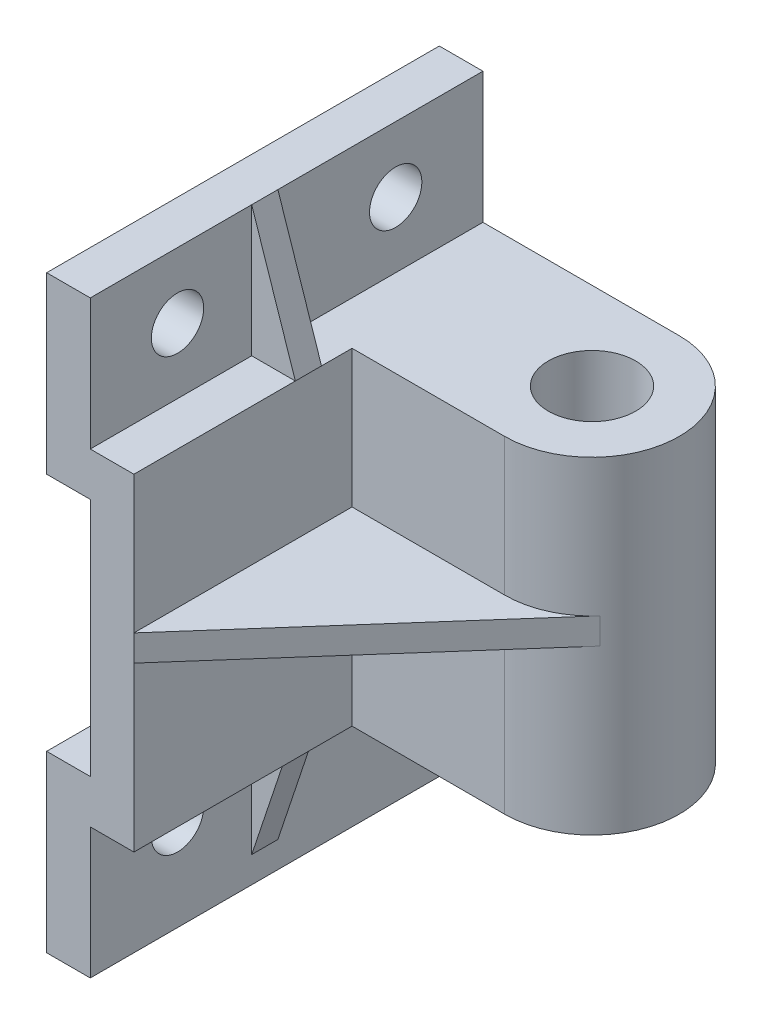
ISO-10303-21;
HEADER;
FILE_DESCRIPTION(('STEP AP214'),'2;1');
FILE_NAME('part.step','',(''),(''),'','','');
FILE_SCHEMA(('AUTOMOTIVE_DESIGN { 1 0 10303 214 1 1 1 1 }'));
ENDSEC;
DATA;
#1=APPLICATION_CONTEXT('core data for automotive mechanical design processes');
#2=APPLICATION_PROTOCOL_DEFINITION('international standard','automotive_design',2000,#1);
#3=PRODUCT_CONTEXT('',#1,'mechanical');
#4=PRODUCT('Part','Part','',(#3));
#5=PRODUCT_RELATED_PRODUCT_CATEGORY('part','',(#4));
#6=PRODUCT_DEFINITION_FORMATION('','',#4);
#7=PRODUCT_DEFINITION_CONTEXT('part definition',#1,'design');
#8=PRODUCT_DEFINITION('design','',#6,#7);
#9=PRODUCT_DEFINITION_SHAPE('','',#8);
#10=(LENGTH_UNIT() NAMED_UNIT(*) SI_UNIT(.MILLI.,.METRE.));
#11=(NAMED_UNIT(*) PLANE_ANGLE_UNIT() SI_UNIT($,.RADIAN.));
#12=(NAMED_UNIT(*) SI_UNIT($,.STERADIAN.) SOLID_ANGLE_UNIT());
#13=UNCERTAINTY_MEASURE_WITH_UNIT(LENGTH_MEASURE(1.E-05),#10,'distance_accuracy_value','');
#14=(GEOMETRIC_REPRESENTATION_CONTEXT(3) GLOBAL_UNCERTAINTY_ASSIGNED_CONTEXT((#13)) GLOBAL_UNIT_ASSIGNED_CONTEXT((#10,
#11,#12)) REPRESENTATION_CONTEXT('',''));
#15=CARTESIAN_POINT('',(0.,0.,0.));
#16=DIRECTION('',(0.,0.,1.));
#17=DIRECTION('',(1.,0.,0.));
#18=AXIS2_PLACEMENT_3D('',#15,#16,#17);
#19=CARTESIAN_POINT('',(20.,73.5,0.));
#20=DIRECTION('',(1.,0.,0.));
#21=DIRECTION('',(0.,1.,0.));
#22=AXIS2_PLACEMENT_3D('',#19,#20,#21);
#23=PLANE('',#22);
#24=DIRECTION('',(0.,0.,1.));
#25=VECTOR('',#24,1.);
#26=CARTESIAN_POINT('',(20.0000000000001,67.5,0.));
#27=LINE('',#26,#25);
#28=CARTESIAN_POINT('',(20.0000000000001,67.5,-50.));
#29=VERTEX_POINT('',#28);
#30=CARTESIAN_POINT('',(20.0000000000001,67.5,0.));
#31=VERTEX_POINT('',#30);
#32=EDGE_CURVE('E118',#29,#31,#27,.T.);
#33=ORIENTED_EDGE('',*,*,#32,.T.);
#34=DIRECTION('',(0.,-1.,0.));
#35=VECTOR('',#34,1.);
#36=CARTESIAN_POINT('',(20.,73.5,0.));
#37=LINE('',#36,#35);
#38=CARTESIAN_POINT('',(20.,73.5,0.));
#39=VERTEX_POINT('',#38);
#40=EDGE_CURVE('E12',#39,#31,#37,.T.);
#41=ORIENTED_EDGE('',*,*,#40,.F.);
#42=DIRECTION('',(0.,0.,1.));
#43=VECTOR('',#42,1.);
#44=CARTESIAN_POINT('',(20.,73.5,0.));
#45=LINE('',#44,#43);
#46=CARTESIAN_POINT('',(20.,73.5,-50.));
#47=VERTEX_POINT('',#46);
#48=EDGE_CURVE('E106',#47,#39,#45,.T.);
#49=ORIENTED_EDGE('',*,*,#48,.F.);
#50=DIRECTION('',(0.,-1.,0.));
#51=VECTOR('',#50,1.);
#52=CARTESIAN_POINT('',(20.,73.5,-50.));
#53=LINE('',#52,#51);
#54=EDGE_CURVE('E114',#47,#29,#53,.T.);
#55=ORIENTED_EDGE('',*,*,#54,.T.);
#56=EDGE_LOOP('',(#33,#41,#49,#55));
#57=FACE_BOUND('',#56,.T.);
#58=ADVANCED_FACE('F55',(#57),#23,.F.);
#59=CARTESIAN_POINT('',(20.,73.5,0.));
#60=DIRECTION('',(-0.750442625738374,0.,-0.660935598583474));
#61=DIRECTION('',(-0.660935598583474,0.,0.750442625738374));
#62=AXIS2_PLACEMENT_3D('',#59,#60,#61);
#63=PLANE('',#62);
#64=DIRECTION('',(0.660935598583473,0.,-0.750442625738374));
#65=VECTOR('',#64,1.);
#66=CARTESIAN_POINT('',(20.0000000000001,67.5,0.));
#67=LINE('',#66,#65);
#68=CARTESIAN_POINT('',(70.0088525147676,67.5000000000001,-56.7812880283305));
#69=VERTEX_POINT('',#68);
#70=EDGE_CURVE('E110',#31,#69,#67,.T.);
#71=ORIENTED_EDGE('',*,*,#70,.T.);
#72=DIRECTION('',(0.,-1.,0.));
#73=VECTOR('',#72,1.);
#74=CARTESIAN_POINT('',(70.0088525147676,73.5000000000001,-56.7812880283305));
#75=LINE('',#74,#73);
#76=CARTESIAN_POINT('',(70.0088525147676,73.5000000000001,-56.7812880283305));
#77=VERTEX_POINT('',#76);
#78=EDGE_CURVE('E63',#77,#69,#75,.T.);
#79=ORIENTED_EDGE('',*,*,#78,.F.);
#80=DIRECTION('',(0.660935598583473,0.,-0.750442625738374));
#81=VECTOR('',#80,1.);
#82=CARTESIAN_POINT('',(20.,73.5,0.));
#83=LINE('',#82,#81);
#84=EDGE_CURVE('E101',#39,#77,#83,.T.);
#85=ORIENTED_EDGE('',*,*,#84,.F.);
#86=ORIENTED_EDGE('',*,*,#40,.T.);
#87=EDGE_LOOP('',(#71,#79,#85,#86));
#88=FACE_BOUND('',#87,.T.);
#89=ADVANCED_FACE('F109',(#88),#63,.F.);
#90=CARTESIAN_POINT('',(55.0000000000001,73.5000000000001,-70.));
#91=DIRECTION('',(0.,-1.,0.));
#92=DIRECTION('',(1.,0.,0.));
#93=AXIS2_PLACEMENT_3D('',#90,#91,#92);
#94=CYLINDRICAL_SURFACE('',#93,20.);
#95=CARTESIAN_POINT('',(55.0000000000001,67.5000000000001,-70.));
#96=DIRECTION('',(0.,-1.,0.));
#97=DIRECTION('',(-1.,0.,0.));
#98=AXIS2_PLACEMENT_3D('',#95,#96,#97);
#99=CIRCLE('',#98,20.);
#100=CARTESIAN_POINT('',(55.0000000000001,67.5000000000001,-50.));
#101=VERTEX_POINT('',#100);
#102=EDGE_CURVE('E88',#69,#101,#99,.T.);
#103=ORIENTED_EDGE('',*,*,#102,.T.);
#104=DIRECTION('',(0.,-1.,0.));
#105=VECTOR('',#104,1.);
#106=CARTESIAN_POINT('',(55.0000000000001,73.5000000000001,-50.));
#107=LINE('',#106,#105);
#108=CARTESIAN_POINT('',(55.0000000000001,73.5000000000001,-50.));
#109=VERTEX_POINT('',#108);
#110=EDGE_CURVE('E111',#109,#101,#107,.T.);
#111=ORIENTED_EDGE('',*,*,#110,.F.);
#112=CARTESIAN_POINT('',(55.0000000000001,73.5000000000001,-70.));
#113=DIRECTION('',(0.,-1.,0.));
#114=DIRECTION('',(-1.,0.,0.));
#115=AXIS2_PLACEMENT_3D('',#112,#113,#114);
#116=CIRCLE('',#115,20.);
#117=EDGE_CURVE('E104',#77,#109,#116,.T.);
#118=ORIENTED_EDGE('',*,*,#117,.F.);
#119=ORIENTED_EDGE('',*,*,#78,.T.);
#120=EDGE_LOOP('',(#103,#111,#118,#119));
#121=FACE_BOUND('',#120,.T.);
#122=ADVANCED_FACE('F112',(#121),#94,.F.);
#123=CARTESIAN_POINT('',(20.,73.5,-50.));
#124=DIRECTION('',(0.,0.,1.));
#125=DIRECTION('',(1.,0.,0.));
#126=AXIS2_PLACEMENT_3D('',#123,#124,#125);
#127=PLANE('',#126);
#128=DIRECTION('',(-1.,0.,0.));
#129=VECTOR('',#128,1.);
#130=CARTESIAN_POINT('',(20.0000000000001,67.5,-50.));
#131=LINE('',#130,#129);
#132=EDGE_CURVE('E94',#101,#29,#131,.T.);
#133=ORIENTED_EDGE('',*,*,#132,.T.);
#134=ORIENTED_EDGE('',*,*,#54,.F.);
#135=DIRECTION('',(-1.,0.,0.));
#136=VECTOR('',#135,1.);
#137=CARTESIAN_POINT('',(20.,73.5,-50.));
#138=LINE('',#137,#136);
#139=EDGE_CURVE('E71',#109,#47,#138,.T.);
#140=ORIENTED_EDGE('',*,*,#139,.F.);
#141=ORIENTED_EDGE('',*,*,#110,.T.);
#142=EDGE_LOOP('',(#133,#134,#140,#141));
#143=FACE_BOUND('',#142,.T.);
#144=ADVANCED_FACE('F125',(#143),#127,.F.);
#145=CARTESIAN_POINT('',(55.0000000000001,73.5000000000001,-70.));
#146=DIRECTION('',(0.,1.,0.));
#147=DIRECTION('',(-1.,0.,0.));
#148=AXIS2_PLACEMENT_3D('',#145,#146,#147);
#149=PLANE('',#148);
#150=ORIENTED_EDGE('',*,*,#48,.T.);
#151=ORIENTED_EDGE('',*,*,#84,.T.);
#152=ORIENTED_EDGE('',*,*,#117,.T.);
#153=ORIENTED_EDGE('',*,*,#139,.T.);
#154=EDGE_LOOP('',(#150,#151,#152,#153));
#155=FACE_BOUND('',#154,.T.);
#156=ADVANCED_FACE('F102',(#155),#149,.T.);
#157=CARTESIAN_POINT('',(55.0000000000001,67.5000000000001,-70.));
#158=DIRECTION('',(0.,1.,0.));
#159=DIRECTION('',(-1.,0.,0.));
#160=AXIS2_PLACEMENT_3D('',#157,#158,#159);
#161=PLANE('',#160);
#162=ORIENTED_EDGE('',*,*,#32,.F.);
#163=ORIENTED_EDGE('',*,*,#132,.F.);
#164=ORIENTED_EDGE('',*,*,#102,.F.);
#165=ORIENTED_EDGE('',*,*,#70,.F.);
#166=EDGE_LOOP('',(#162,#163,#164,#165));
#167=FACE_BOUND('',#166,.T.);
#168=ADVANCED_FACE('F128',(#167),#161,.F.);
#169=CLOSED_SHELL('',(#58,#89,#122,#144,#156,#168));
#170=MANIFOLD_SOLID_BREP('B2',#169);
#171=CARTESIAN_POINT('',(0.,135.,-90.));
#172=DIRECTION('',(-1.,0.,0.));
#173=DIRECTION('',(0.,-1.,0.));
#174=AXIS2_PLACEMENT_3D('',#171,#172,#173);
#175=PLANE('',#174);
#176=CARTESIAN_POINT('',(0.,120.,-70.));
#177=DIRECTION('',(-1.,0.,0.));
#178=DIRECTION('',(0.,-1.,0.));
#179=AXIS2_PLACEMENT_3D('',#176,#177,#178);
#180=CIRCLE('',#179,5.99999999999999);
#181=CARTESIAN_POINT('',(0.,114.,-70.));
#182=VERTEX_POINT('',#181);
#183=EDGE_CURVE('E338',#182,#182,#180,.F.);
#184=ORIENTED_EDGE('',*,*,#183,.T.);
#185=EDGE_LOOP('',(#184));
#186=FACE_BOUND('',#185,.T.);
#187=DIRECTION('',(0.,-1.,0.));
#188=VECTOR('',#187,1.);
#189=CARTESIAN_POINT('',(0.,135.,0.));
#190=LINE('',#189,#188);
#191=CARTESIAN_POINT('',(0.,135.,0.));
#192=VERTEX_POINT('',#191);
#193=CARTESIAN_POINT('',(0.,95.,0.));
#194=VERTEX_POINT('',#193);
#195=EDGE_CURVE('E494',#192,#194,#190,.T.);
#196=ORIENTED_EDGE('',*,*,#195,.F.);
#197=DIRECTION('',(0.,0.,1.));
#198=VECTOR('',#197,1.);
#199=CARTESIAN_POINT('',(0.,135.,-90.));
#200=LINE('',#199,#198);
#201=CARTESIAN_POINT('',(0.,135.,-90.));
#202=VERTEX_POINT('',#201);
#203=EDGE_CURVE('E517',#202,#192,#200,.T.);
#204=ORIENTED_EDGE('',*,*,#203,.F.);
#205=DIRECTION('',(0.,-1.,0.));
#206=VECTOR('',#205,1.);
#207=CARTESIAN_POINT('',(0.,135.,-90.));
#208=LINE('',#207,#206);
#209=CARTESIAN_POINT('',(0.,95.,-90.));
#210=VERTEX_POINT('',#209);
#211=EDGE_CURVE('E447',#202,#210,#208,.T.);
#212=ORIENTED_EDGE('',*,*,#211,.T.);
#213=DIRECTION('',(0.,0.,1.));
#214=VECTOR('',#213,1.);
#215=CARTESIAN_POINT('',(0.,95.,-90.));
#216=LINE('',#215,#214);
#217=EDGE_CURVE('E514',#210,#194,#216,.T.);
#218=ORIENTED_EDGE('',*,*,#217,.T.);
#219=EDGE_LOOP('',(#196,#204,#212,#218));
#220=FACE_BOUND('',#219,.T.);
#221=CARTESIAN_POINT('',(0.,120.,-20.));
#222=DIRECTION('',(-1.,0.,0.));
#223=DIRECTION('',(0.,-1.,0.));
#224=AXIS2_PLACEMENT_3D('',#221,#222,#223);
#225=CIRCLE('',#224,5.99999999999999);
#226=CARTESIAN_POINT('',(0.,114.,-20.));
#227=VERTEX_POINT('',#226);
#228=EDGE_CURVE('E875',#227,#227,#225,.F.);
#229=ORIENTED_EDGE('',*,*,#228,.T.);
#230=EDGE_LOOP('',(#229));
#231=FACE_BOUND('',#230,.T.);
#232=ADVANCED_FACE('F179',(#186,#220,#231),#175,.T.);
#233=CARTESIAN_POINT('',(10.,30.,-90.));
#234=DIRECTION('',(0.,-1.,0.));
#235=DIRECTION('',(1.,0.,0.));
#236=AXIS2_PLACEMENT_3D('',#233,#234,#235);
#237=PLANE('',#236);
#238=CARTESIAN_POINT('',(55.0000000000001,30.,-70.));
#239=DIRECTION('',(0.,-1.,0.));
#240=DIRECTION('',(1.,0.,0.));
#241=AXIS2_PLACEMENT_3D('',#238,#239,#240);
#242=CIRCLE('',#241,9.99999999999999);
#243=CARTESIAN_POINT('',(65.0000000000001,30.,-70.));
#244=VERTEX_POINT('',#243);
#245=EDGE_CURVE('E388',#244,#244,#242,.F.);
#246=ORIENTED_EDGE('',*,*,#245,.T.);
#247=EDGE_LOOP('',(#246));
#248=FACE_BOUND('',#247,.T.);
#249=DIRECTION('',(0.,0.,-1.));
#250=VECTOR('',#249,1.);
#251=CARTESIAN_POINT('',(18.0000000000001,30.,-90.));
#252=LINE('',#251,#250);
#253=CARTESIAN_POINT('',(18.0000000000001,30.,-37.));
#254=VERTEX_POINT('',#253);
#255=CARTESIAN_POINT('',(18.0000000000001,30.,-43.));
#256=VERTEX_POINT('',#255);
#257=EDGE_CURVE('E197',#254,#256,#252,.T.);
#258=ORIENTED_EDGE('',*,*,#257,.T.);
#259=DIRECTION('',(-1.,0.,0.));
#260=VECTOR('',#259,1.);
#261=CARTESIAN_POINT('',(10.,30.,-43.));
#262=LINE('',#261,#260);
#263=CARTESIAN_POINT('',(10.,30.,-43.));
#264=VERTEX_POINT('',#263);
#265=EDGE_CURVE('E349',#256,#264,#262,.T.);
#266=ORIENTED_EDGE('',*,*,#265,.T.);
#267=DIRECTION('',(0.,0.,1.));
#268=VECTOR('',#267,1.);
#269=CARTESIAN_POINT('',(10.,30.,-90.));
#270=LINE('',#269,#268);
#271=CARTESIAN_POINT('',(10.,30.,-90.));
#272=VERTEX_POINT('',#271);
#273=EDGE_CURVE('E538',#272,#264,#270,.T.);
#274=ORIENTED_EDGE('',*,*,#273,.F.);
#275=DIRECTION('',(1.,0.,0.));
#276=VECTOR('',#275,1.);
#277=CARTESIAN_POINT('',(10.,30.,-90.));
#278=LINE('',#277,#276);
#279=CARTESIAN_POINT('',(55.0000000000002,30.,-90.));
#280=VERTEX_POINT('',#279);
#281=EDGE_CURVE('E432',#272,#280,#278,.T.);
#282=ORIENTED_EDGE('',*,*,#281,.T.);
#283=CARTESIAN_POINT('',(55.0000000000001,30.,-70.));
#284=DIRECTION('',(0.,-1.,0.));
#285=DIRECTION('',(1.,0.,0.));
#286=AXIS2_PLACEMENT_3D('',#283,#284,#285);
#287=CIRCLE('',#286,20.);
#288=CARTESIAN_POINT('',(55.0000000000002,30.,-50.));
#289=VERTEX_POINT('',#288);
#290=EDGE_CURVE('E381',#289,#280,#287,.F.);
#291=ORIENTED_EDGE('',*,*,#290,.F.);
#292=DIRECTION('',(1.,0.,0.));
#293=VECTOR('',#292,1.);
#294=CARTESIAN_POINT('',(55.0000000000002,30.,-50.));
#295=LINE('',#294,#293);
#296=CARTESIAN_POINT('',(20.0000000000001,30.,-50.));
#297=VERTEX_POINT('',#296);
#298=EDGE_CURVE('E406',#297,#289,#295,.T.);
#299=ORIENTED_EDGE('',*,*,#298,.F.);
#300=DIRECTION('',(0.,0.,1.));
#301=VECTOR('',#300,1.);
#302=CARTESIAN_POINT('',(20.,30.,-90.));
#303=LINE('',#302,#301);
#304=CARTESIAN_POINT('',(20.,30.,0.));
#305=VERTEX_POINT('',#304);
#306=EDGE_CURVE('E535',#297,#305,#303,.T.);
#307=ORIENTED_EDGE('',*,*,#306,.T.);
#308=DIRECTION('',(1.,0.,0.));
#309=VECTOR('',#308,1.);
#310=CARTESIAN_POINT('',(10.,30.,0.));
#311=LINE('',#310,#309);
#312=CARTESIAN_POINT('',(10.,30.,0.));
#313=VERTEX_POINT('',#312);
#314=EDGE_CURVE('E474',#313,#305,#311,.T.);
#315=ORIENTED_EDGE('',*,*,#314,.F.);
#316=CARTESIAN_POINT('',(10.,30.,-37.));
#317=VERTEX_POINT('',#316);
#318=EDGE_CURVE('E540',#317,#313,#270,.T.);
#319=ORIENTED_EDGE('',*,*,#318,.F.);
#320=DIRECTION('',(-1.,0.,0.));
#321=VECTOR('',#320,1.);
#322=CARTESIAN_POINT('',(10.,30.,-37.));
#323=LINE('',#322,#321);
#324=EDGE_CURVE('E202',#254,#317,#323,.T.);
#325=ORIENTED_EDGE('',*,*,#324,.F.);
#326=EDGE_LOOP('',(#258,#266,#274,#282,#291,#299,#307,#315,#319,#325));
#327=FACE_BOUND('',#326,.T.);
#328=ADVANCED_FACE('F568',(#248,#327),#237,.T.);
#329=CARTESIAN_POINT('',(10.,0.,-90.));
#330=DIRECTION('',(1.,0.,0.));
#331=DIRECTION('',(0.,0.,-1.));
#332=AXIS2_PLACEMENT_3D('',#329,#330,#331);
#333=PLANE('',#332);
#334=CARTESIAN_POINT('',(10.0000000000001,21.,-20.));
#335=DIRECTION('',(1.,0.,0.));
#336=DIRECTION('',(0.,0.,-1.));
#337=AXIS2_PLACEMENT_3D('',#334,#335,#336);
#338=CIRCLE('',#337,6.);
#339=CARTESIAN_POINT('',(10.0000000000001,21.,-26.));
#340=VERTEX_POINT('',#339);
#341=EDGE_CURVE('E897',#340,#340,#338,.T.);
#342=ORIENTED_EDGE('',*,*,#341,.F.);
#343=EDGE_LOOP('',(#342));
#344=FACE_BOUND('',#343,.T.);
#345=CARTESIAN_POINT('',(10.0000000000001,21.,-70.));
#346=DIRECTION('',(1.,0.,0.));
#347=DIRECTION('',(0.,0.,-1.));
#348=AXIS2_PLACEMENT_3D('',#345,#346,#347);
#349=CIRCLE('',#348,6.);
#350=CARTESIAN_POINT('',(10.0000000000001,21.,-76.));
#351=VERTEX_POINT('',#350);
#352=EDGE_CURVE('E870',#351,#351,#349,.T.);
#353=ORIENTED_EDGE('',*,*,#352,.F.);
#354=EDGE_LOOP('',(#353));
#355=FACE_BOUND('',#354,.T.);
#356=ORIENTED_EDGE('',*,*,#273,.T.);
#357=DIRECTION('',(0.,1.,0.));
#358=VECTOR('',#357,1.);
#359=CARTESIAN_POINT('',(10.0000000000001,36.,-43.));
#360=LINE('',#359,#358);
#361=CARTESIAN_POINT('',(10.,5.9999999999997,-43.));
#362=VERTEX_POINT('',#361);
#363=EDGE_CURVE('E323',#362,#264,#360,.T.);
#364=ORIENTED_EDGE('',*,*,#363,.F.);
#365=DIRECTION('',(0.,0.,1.));
#366=VECTOR('',#365,1.);
#367=CARTESIAN_POINT('',(10.0000000000001,5.99999999999998,-43.));
#368=LINE('',#367,#366);
#369=CARTESIAN_POINT('',(10.0000000000001,5.99999999999998,-37.));
#370=VERTEX_POINT('',#369);
#371=EDGE_CURVE('E316',#362,#370,#368,.T.);
#372=ORIENTED_EDGE('',*,*,#371,.T.);
#373=DIRECTION('',(0.,1.,0.));
#374=VECTOR('',#373,1.);
#375=CARTESIAN_POINT('',(10.0000000000001,36.,-37.));
#376=LINE('',#375,#374);
#377=EDGE_CURVE('E321',#370,#317,#376,.T.);
#378=ORIENTED_EDGE('',*,*,#377,.T.);
#379=ORIENTED_EDGE('',*,*,#318,.T.);
#380=DIRECTION('',(0.,1.,0.));
#381=VECTOR('',#380,1.);
#382=CARTESIAN_POINT('',(10.,0.,0.));
#383=LINE('',#382,#381);
#384=CARTESIAN_POINT('',(10.,0.,0.));
#385=VERTEX_POINT('',#384);
#386=EDGE_CURVE('E470',#385,#313,#383,.T.);
#387=ORIENTED_EDGE('',*,*,#386,.F.);
#388=DIRECTION('',(0.,0.,1.));
#389=VECTOR('',#388,1.);
#390=CARTESIAN_POINT('',(10.,0.,-90.));
#391=LINE('',#390,#389);
#392=CARTESIAN_POINT('',(10.,0.,-90.));
#393=VERTEX_POINT('',#392);
#394=EDGE_CURVE('E541',#393,#385,#391,.T.);
#395=ORIENTED_EDGE('',*,*,#394,.F.);
#396=DIRECTION('',(0.,1.,0.));
#397=VECTOR('',#396,1.);
#398=CARTESIAN_POINT('',(10.,0.,-90.));
#399=LINE('',#398,#397);
#400=EDGE_CURVE('E428',#393,#272,#399,.T.);
#401=ORIENTED_EDGE('',*,*,#400,.T.);
#402=EDGE_LOOP('',(#356,#364,#372,#378,#379,#387,#395,#401));
#403=FACE_BOUND('',#402,.T.);
#404=ADVANCED_FACE('F319',(#344,#355,#403),#333,.T.);
#405=CARTESIAN_POINT('',(10.,105.,-90.));
#406=DIRECTION('',(1.,0.,0.));
#407=DIRECTION('',(0.,1.,0.));
#408=AXIS2_PLACEMENT_3D('',#405,#406,#407);
#409=PLANE('',#408);
#410=CARTESIAN_POINT('',(10.,120.,-70.));
#411=DIRECTION('',(1.,0.,0.));
#412=DIRECTION('',(0.,0.,-1.));
#413=AXIS2_PLACEMENT_3D('',#410,#411,#412);
#414=CIRCLE('',#413,5.99999999999999);
#415=CARTESIAN_POINT('',(10.,120.,-76.));
#416=VERTEX_POINT('',#415);
#417=EDGE_CURVE('E342',#416,#416,#414,.T.);
#418=ORIENTED_EDGE('',*,*,#417,.F.);
#419=EDGE_LOOP('',(#418));
#420=FACE_BOUND('',#419,.T.);
#421=DIRECTION('',(0.,0.,1.));
#422=VECTOR('',#421,1.);
#423=CARTESIAN_POINT('',(10.,135.,-90.));
#424=LINE('',#423,#422);
#425=CARTESIAN_POINT('',(10.,135.,-90.));
#426=VERTEX_POINT('',#425);
#427=CARTESIAN_POINT('',(10.,135.,-43.));
#428=VERTEX_POINT('',#427);
#429=EDGE_CURVE('E520',#426,#428,#424,.T.);
#430=ORIENTED_EDGE('',*,*,#429,.T.);
#431=DIRECTION('',(0.,-1.,0.));
#432=VECTOR('',#431,1.);
#433=CARTESIAN_POINT('',(10.,105.,-43.));
#434=LINE('',#433,#432);
#435=CARTESIAN_POINT('',(10.,105.,-43.));
#436=VERTEX_POINT('',#435);
#437=EDGE_CURVE('E355',#428,#436,#434,.T.);
#438=ORIENTED_EDGE('',*,*,#437,.T.);
#439=DIRECTION('',(0.,0.,1.));
#440=VECTOR('',#439,1.);
#441=CARTESIAN_POINT('',(10.,105.,-90.));
#442=LINE('',#441,#440);
#443=CARTESIAN_POINT('',(10.,105.,-90.));
#444=VERTEX_POINT('',#443);
#445=EDGE_CURVE('E525',#444,#436,#442,.T.);
#446=ORIENTED_EDGE('',*,*,#445,.F.);
#447=DIRECTION('',(0.,1.,0.));
#448=VECTOR('',#447,1.);
#449=CARTESIAN_POINT('',(10.,105.,-90.));
#450=LINE('',#449,#448);
#451=EDGE_CURVE('E439',#444,#426,#450,.T.);
#452=ORIENTED_EDGE('',*,*,#451,.T.);
#453=EDGE_LOOP('',(#430,#438,#446,#452));
#454=FACE_BOUND('',#453,.T.);
#455=ADVANCED_FACE('F601',(#420,#454),#409,.T.);
#456=CARTESIAN_POINT('',(20.,105.,-90.));
#457=DIRECTION('',(0.,1.,0.));
#458=DIRECTION('',(-1.,0.,0.));
#459=AXIS2_PLACEMENT_3D('',#456,#457,#458);
#460=PLANE('',#459);
#461=CARTESIAN_POINT('',(55.,105.,-70.));
#462=DIRECTION('',(0.,1.,0.));
#463=DIRECTION('',(-1.,0.,0.));
#464=AXIS2_PLACEMENT_3D('',#461,#462,#463);
#465=CIRCLE('',#464,9.99999999999999);
#466=CARTESIAN_POINT('',(45.0000000000001,105.,-70.));
#467=VERTEX_POINT('',#466);
#468=EDGE_CURVE('E393',#467,#467,#465,.T.);
#469=ORIENTED_EDGE('',*,*,#468,.F.);
#470=EDGE_LOOP('',(#469));
#471=FACE_BOUND('',#470,.T.);
#472=ORIENTED_EDGE('',*,*,#445,.T.);
#473=DIRECTION('',(1.,0.,0.));
#474=VECTOR('',#473,1.);
#475=CARTESIAN_POINT('',(20.,105.,-43.));
#476=LINE('',#475,#474);
#477=CARTESIAN_POINT('',(20.,105.,-43.));
#478=VERTEX_POINT('',#477);
#479=EDGE_CURVE('E358',#436,#478,#476,.T.);
#480=ORIENTED_EDGE('',*,*,#479,.T.);
#481=DIRECTION('',(0.,0.,1.));
#482=VECTOR('',#481,1.);
#483=CARTESIAN_POINT('',(20.,105.,-90.));
#484=LINE('',#483,#482);
#485=CARTESIAN_POINT('',(20.,105.,-50.));
#486=VERTEX_POINT('',#485);
#487=EDGE_CURVE('E530',#486,#478,#484,.T.);
#488=ORIENTED_EDGE('',*,*,#487,.F.);
#489=DIRECTION('',(1.,0.,0.));
#490=VECTOR('',#489,1.);
#491=CARTESIAN_POINT('',(55.,105.,-50.));
#492=LINE('',#491,#490);
#493=CARTESIAN_POINT('',(55.,105.,-50.));
#494=VERTEX_POINT('',#493);
#495=EDGE_CURVE('E384',#486,#494,#492,.T.);
#496=ORIENTED_EDGE('',*,*,#495,.T.);
#497=CARTESIAN_POINT('',(55.,105.,-70.));
#498=DIRECTION('',(0.,1.,0.));
#499=DIRECTION('',(-1.,0.,0.));
#500=AXIS2_PLACEMENT_3D('',#497,#498,#499);
#501=CIRCLE('',#500,20.);
#502=CARTESIAN_POINT('',(55.,105.,-90.));
#503=VERTEX_POINT('',#502);
#504=EDGE_CURVE('E389',#494,#503,#501,.T.);
#505=ORIENTED_EDGE('',*,*,#504,.T.);
#506=DIRECTION('',(-1.,0.,0.));
#507=VECTOR('',#506,1.);
#508=CARTESIAN_POINT('',(20.,105.,-90.));
#509=LINE('',#508,#507);
#510=EDGE_CURVE('E435',#503,#444,#509,.T.);
#511=ORIENTED_EDGE('',*,*,#510,.T.);
#512=EDGE_LOOP('',(#472,#480,#488,#496,#505,#511));
#513=FACE_BOUND('',#512,.T.);
#514=ADVANCED_FACE('F605',(#471,#513),#460,.T.);
#515=CARTESIAN_POINT('',(20.,30.,-90.));
#516=DIRECTION('',(1.,0.,0.));
#517=DIRECTION('',(0.,1.,0.));
#518=AXIS2_PLACEMENT_3D('',#515,#516,#517);
#519=PLANE('',#518);
#520=ORIENTED_EDGE('',*,*,#306,.F.);
#521=DIRECTION('',(0.,1.,0.));
#522=VECTOR('',#521,1.);
#523=CARTESIAN_POINT('',(20.0000000000002,-38.0073525436772,-50.));
#524=LINE('',#523,#522);
#525=EDGE_CURVE('E397',#297,#486,#524,.T.);
#526=ORIENTED_EDGE('',*,*,#525,.T.);
#527=ORIENTED_EDGE('',*,*,#487,.T.);
#528=DIRECTION('',(0.,0.,1.));
#529=VECTOR('',#528,1.);
#530=CARTESIAN_POINT('',(20.,105.,-43.));
#531=LINE('',#530,#529);
#532=CARTESIAN_POINT('',(20.,105.,-37.));
#533=VERTEX_POINT('',#532);
#534=EDGE_CURVE('E366',#478,#533,#531,.T.);
#535=ORIENTED_EDGE('',*,*,#534,.T.);
#536=CARTESIAN_POINT('',(20.,105.,0.));
#537=VERTEX_POINT('',#536);
#538=EDGE_CURVE('E534',#533,#537,#484,.T.);
#539=ORIENTED_EDGE('',*,*,#538,.T.);
#540=DIRECTION('',(0.,1.,0.));
#541=VECTOR('',#540,1.);
#542=CARTESIAN_POINT('',(20.,30.,0.));
#543=LINE('',#542,#541);
#544=EDGE_CURVE('E478',#305,#537,#543,.T.);
#545=ORIENTED_EDGE('',*,*,#544,.F.);
#546=EDGE_LOOP('',(#520,#526,#527,#535,#539,#545));
#547=FACE_BOUND('',#546,.T.);
#548=ADVANCED_FACE('F572',(#547),#519,.T.);
#549=CARTESIAN_POINT('',(0.,40.,-90.));
#550=DIRECTION('',(-1.,0.,0.));
#551=DIRECTION('',(0.,-1.,0.));
#552=AXIS2_PLACEMENT_3D('',#549,#550,#551);
#553=PLANE('',#552);
#554=CARTESIAN_POINT('',(0.,21.,-20.));
#555=DIRECTION('',(1.,0.,0.));
#556=DIRECTION('',(0.,0.,-1.));
#557=AXIS2_PLACEMENT_3D('',#554,#555,#556);
#558=CIRCLE('',#557,6.);
#559=CARTESIAN_POINT('',(0.,21.,-26.));
#560=VERTEX_POINT('',#559);
#561=EDGE_CURVE('E864',#560,#560,#558,.T.);
#562=ORIENTED_EDGE('',*,*,#561,.T.);
#563=EDGE_LOOP('',(#562));
#564=FACE_BOUND('',#563,.T.);
#565=CARTESIAN_POINT('',(0.,21.,-70.));
#566=DIRECTION('',(1.,0.,0.));
#567=DIRECTION('',(0.,0.,-1.));
#568=AXIS2_PLACEMENT_3D('',#565,#566,#567);
#569=CIRCLE('',#568,6.);
#570=CARTESIAN_POINT('',(0.,21.,-76.));
#571=VERTEX_POINT('',#570);
#572=EDGE_CURVE('E867',#571,#571,#569,.T.);
#573=ORIENTED_EDGE('',*,*,#572,.T.);
#574=EDGE_LOOP('',(#573));
#575=FACE_BOUND('',#574,.T.);
#576=DIRECTION('',(0.,-1.,0.));
#577=VECTOR('',#576,1.);
#578=CARTESIAN_POINT('',(0.,40.,0.));
#579=LINE('',#578,#577);
#580=CARTESIAN_POINT('',(0.,40.,0.));
#581=VERTEX_POINT('',#580);
#582=CARTESIAN_POINT('',(0.,0.,0.));
#583=VERTEX_POINT('',#582);
#584=EDGE_CURVE('E401',#581,#583,#579,.T.);
#585=ORIENTED_EDGE('',*,*,#584,.F.);
#586=DIRECTION('',(0.,0.,1.));
#587=VECTOR('',#586,1.);
#588=CARTESIAN_POINT('',(0.,40.,-90.));
#589=LINE('',#588,#587);
#590=CARTESIAN_POINT('',(0.,40.,-90.));
#591=VERTEX_POINT('',#590);
#592=EDGE_CURVE('E53',#591,#581,#589,.T.);
#593=ORIENTED_EDGE('',*,*,#592,.F.);
#594=DIRECTION('',(0.,-1.,0.));
#595=VECTOR('',#594,1.);
#596=CARTESIAN_POINT('',(0.,40.,-90.));
#597=LINE('',#596,#595);
#598=CARTESIAN_POINT('',(0.,0.,-90.));
#599=VERTEX_POINT('',#598);
#600=EDGE_CURVE('E419',#591,#599,#597,.T.);
#601=ORIENTED_EDGE('',*,*,#600,.T.);
#602=DIRECTION('',(0.,0.,1.));
#603=VECTOR('',#602,1.);
#604=CARTESIAN_POINT('',(0.,0.,-90.));
#605=LINE('',#604,#603);
#606=EDGE_CURVE('E183',#599,#583,#605,.T.);
#607=ORIENTED_EDGE('',*,*,#606,.T.);
#608=EDGE_LOOP('',(#585,#593,#601,#607));
#609=FACE_BOUND('',#608,.T.);
#610=ADVANCED_FACE('F181',(#564,#575,#609),#553,.T.);
#611=CARTESIAN_POINT('',(10.,40.,-90.));
#612=DIRECTION('',(0.,1.,0.));
#613=DIRECTION('',(-1.,0.,0.));
#614=AXIS2_PLACEMENT_3D('',#611,#612,#613);
#615=PLANE('',#614);
#616=DIRECTION('',(-1.,0.,0.));
#617=VECTOR('',#616,1.);
#618=CARTESIAN_POINT('',(10.,40.,0.));
#619=LINE('',#618,#617);
#620=CARTESIAN_POINT('',(10.,40.,0.));
#621=VERTEX_POINT('',#620);
#622=EDGE_CURVE('E424',#621,#581,#619,.T.);
#623=ORIENTED_EDGE('',*,*,#622,.F.);
#624=DIRECTION('',(0.,0.,1.));
#625=VECTOR('',#624,1.);
#626=CARTESIAN_POINT('',(10.,40.,-90.));
#627=LINE('',#626,#625);
#628=CARTESIAN_POINT('',(10.,40.,-90.));
#629=VERTEX_POINT('',#628);
#630=EDGE_CURVE('E189',#629,#621,#627,.T.);
#631=ORIENTED_EDGE('',*,*,#630,.F.);
#632=DIRECTION('',(-1.,0.,0.));
#633=VECTOR('',#632,1.);
#634=CARTESIAN_POINT('',(10.,40.,-90.));
#635=LINE('',#634,#633);
#636=EDGE_CURVE('E459',#629,#591,#635,.T.);
#637=ORIENTED_EDGE('',*,*,#636,.T.);
#638=ORIENTED_EDGE('',*,*,#592,.T.);
#639=EDGE_LOOP('',(#623,#631,#637,#638));
#640=FACE_BOUND('',#639,.T.);
#641=ADVANCED_FACE('F558',(#640),#615,.T.);
#642=CARTESIAN_POINT('',(9.99999999999999,95.,-90.));
#643=DIRECTION('',(-1.,0.,0.));
#644=DIRECTION('',(0.,-1.,0.));
#645=AXIS2_PLACEMENT_3D('',#642,#643,#644);
#646=PLANE('',#645);
#647=DIRECTION('',(0.,-1.,0.));
#648=VECTOR('',#647,1.);
#649=CARTESIAN_POINT('',(9.99999999999999,95.,0.));
#650=LINE('',#649,#648);
#651=CARTESIAN_POINT('',(9.99999999999999,95.,0.));
#652=VERTEX_POINT('',#651);
#653=EDGE_CURVE('E502',#652,#621,#650,.T.);
#654=ORIENTED_EDGE('',*,*,#653,.F.);
#655=DIRECTION('',(0.,0.,1.));
#656=VECTOR('',#655,1.);
#657=CARTESIAN_POINT('',(9.99999999999999,95.,-90.));
#658=LINE('',#657,#656);
#659=CARTESIAN_POINT('',(9.99999999999999,95.,-90.));
#660=VERTEX_POINT('',#659);
#661=EDGE_CURVE('E511',#660,#652,#658,.T.);
#662=ORIENTED_EDGE('',*,*,#661,.F.);
#663=DIRECTION('',(0.,-1.,0.));
#664=VECTOR('',#663,1.);
#665=CARTESIAN_POINT('',(9.99999999999999,95.,-90.));
#666=LINE('',#665,#664);
#667=EDGE_CURVE('E455',#660,#629,#666,.T.);
#668=ORIENTED_EDGE('',*,*,#667,.T.);
#669=ORIENTED_EDGE('',*,*,#630,.T.);
#670=EDGE_LOOP('',(#654,#662,#668,#669));
#671=FACE_BOUND('',#670,.T.);
#672=ADVANCED_FACE('F598',(#671),#646,.T.);
#673=CARTESIAN_POINT('',(0.,95.,-90.));
#674=DIRECTION('',(0.,-1.,0.));
#675=DIRECTION('',(0.,0.,-1.));
#676=AXIS2_PLACEMENT_3D('',#673,#674,#675);
#677=PLANE('',#676);
#678=DIRECTION('',(1.,0.,0.));
#679=VECTOR('',#678,1.);
#680=CARTESIAN_POINT('',(0.,95.,0.));
#681=LINE('',#680,#679);
#682=EDGE_CURVE('E498',#194,#652,#681,.T.);
#683=ORIENTED_EDGE('',*,*,#682,.F.);
#684=ORIENTED_EDGE('',*,*,#217,.F.);
#685=DIRECTION('',(1.,0.,0.));
#686=VECTOR('',#685,1.);
#687=CARTESIAN_POINT('',(0.,95.,-90.));
#688=LINE('',#687,#686);
#689=EDGE_CURVE('E451',#210,#660,#688,.T.);
#690=ORIENTED_EDGE('',*,*,#689,.T.);
#691=ORIENTED_EDGE('',*,*,#661,.T.);
#692=EDGE_LOOP('',(#683,#684,#690,#691));
#693=FACE_BOUND('',#692,.T.);
#694=ADVANCED_FACE('F595',(#693),#677,.T.);
#695=CARTESIAN_POINT('',(10.,135.,-90.));
#696=DIRECTION('',(0.,1.,0.));
#697=DIRECTION('',(0.,0.,1.));
#698=AXIS2_PLACEMENT_3D('',#695,#696,#697);
#699=PLANE('',#698);
#700=DIRECTION('',(-1.,0.,0.));
#701=VECTOR('',#700,1.);
#702=CARTESIAN_POINT('',(10.,135.,0.));
#703=LINE('',#702,#701);
#704=CARTESIAN_POINT('',(10.,135.,0.));
#705=VERTEX_POINT('',#704);
#706=EDGE_CURVE('E490',#705,#192,#703,.T.);
#707=ORIENTED_EDGE('',*,*,#706,.F.);
#708=CARTESIAN_POINT('',(10.,135.,-37.));
#709=VERTEX_POINT('',#708);
#710=EDGE_CURVE('E524',#709,#705,#424,.T.);
#711=ORIENTED_EDGE('',*,*,#710,.F.);
#712=DIRECTION('',(0.,0.,1.));
#713=VECTOR('',#712,1.);
#714=CARTESIAN_POINT('',(10.,135.,-43.));
#715=LINE('',#714,#713);
#716=EDGE_CURVE('E377',#428,#709,#715,.T.);
#717=ORIENTED_EDGE('',*,*,#716,.F.);
#718=ORIENTED_EDGE('',*,*,#429,.F.);
#719=DIRECTION('',(-1.,0.,0.));
#720=VECTOR('',#719,1.);
#721=CARTESIAN_POINT('',(10.,135.,-90.));
#722=LINE('',#721,#720);
#723=EDGE_CURVE('E443',#426,#202,#722,.T.);
#724=ORIENTED_EDGE('',*,*,#723,.T.);
#725=ORIENTED_EDGE('',*,*,#203,.T.);
#726=EDGE_LOOP('',(#707,#711,#717,#718,#724,#725));
#727=FACE_BOUND('',#726,.T.);
#728=ADVANCED_FACE('F587',(#727),#699,.T.);
#729=CARTESIAN_POINT('',(10.,120.,-20.));
#730=DIRECTION('',(1.,0.,0.));
#731=DIRECTION('',(0.,0.,-1.));
#732=AXIS2_PLACEMENT_3D('',#729,#730,#731);
#733=CIRCLE('',#732,5.99999999999999);
#734=CARTESIAN_POINT('',(10.,120.,-26.));
#735=VERTEX_POINT('',#734);
#736=EDGE_CURVE('E869',#735,#735,#733,.T.);
#737=ORIENTED_EDGE('',*,*,#736,.F.);
#738=EDGE_LOOP('',(#737));
#739=FACE_BOUND('',#738,.T.);
#740=DIRECTION('',(0.,-1.,0.));
#741=VECTOR('',#740,1.);
#742=CARTESIAN_POINT('',(10.,105.,-37.));
#743=LINE('',#742,#741);
#744=CARTESIAN_POINT('',(10.,105.,-37.));
#745=VERTEX_POINT('',#744);
#746=EDGE_CURVE('E354',#709,#745,#743,.T.);
#747=ORIENTED_EDGE('',*,*,#746,.F.);
#748=ORIENTED_EDGE('',*,*,#710,.T.);
#749=DIRECTION('',(0.,1.,0.));
#750=VECTOR('',#749,1.);
#751=CARTESIAN_POINT('',(10.,105.,0.));
#752=LINE('',#751,#750);
#753=CARTESIAN_POINT('',(10.,105.,0.));
#754=VERTEX_POINT('',#753);
#755=EDGE_CURVE('E486',#754,#705,#752,.T.);
#756=ORIENTED_EDGE('',*,*,#755,.F.);
#757=EDGE_CURVE('E529',#745,#754,#442,.T.);
#758=ORIENTED_EDGE('',*,*,#757,.F.);
#759=EDGE_LOOP('',(#747,#748,#756,#758));
#760=FACE_BOUND('',#759,.T.);
#761=ADVANCED_FACE('F583',(#739,#760),#409,.T.);
#762=DIRECTION('',(1.,0.,0.));
#763=VECTOR('',#762,1.);
#764=CARTESIAN_POINT('',(20.,105.,-37.));
#765=LINE('',#764,#763);
#766=EDGE_CURVE('E370',#745,#533,#765,.T.);
#767=ORIENTED_EDGE('',*,*,#766,.F.);
#768=ORIENTED_EDGE('',*,*,#757,.T.);
#769=DIRECTION('',(-1.,0.,0.));
#770=VECTOR('',#769,1.);
#771=CARTESIAN_POINT('',(20.,105.,0.));
#772=LINE('',#771,#770);
#773=EDGE_CURVE('E482',#537,#754,#772,.T.);
#774=ORIENTED_EDGE('',*,*,#773,.F.);
#775=ORIENTED_EDGE('',*,*,#538,.F.);
#776=EDGE_LOOP('',(#767,#768,#774,#775));
#777=FACE_BOUND('',#776,.T.);
#778=ADVANCED_FACE('F578',(#777),#460,.T.);
#779=CARTESIAN_POINT('',(0.,0.,-90.));
#780=DIRECTION('',(0.,-1.,0.));
#781=DIRECTION('',(0.,0.,-1.));
#782=AXIS2_PLACEMENT_3D('',#779,#780,#781);
#783=PLANE('',#782);
#784=DIRECTION('',(1.,0.,0.));
#785=VECTOR('',#784,1.);
#786=CARTESIAN_POINT('',(0.,0.,0.));
#787=LINE('',#786,#785);
#788=EDGE_CURVE('E466',#583,#385,#787,.T.);
#789=ORIENTED_EDGE('',*,*,#788,.F.);
#790=ORIENTED_EDGE('',*,*,#606,.F.);
#791=DIRECTION('',(1.,0.,0.));
#792=VECTOR('',#791,1.);
#793=CARTESIAN_POINT('',(0.,0.,-90.));
#794=LINE('',#793,#792);
#795=EDGE_CURVE('E423',#599,#393,#794,.T.);
#796=ORIENTED_EDGE('',*,*,#795,.T.);
#797=ORIENTED_EDGE('',*,*,#394,.T.);
#798=EDGE_LOOP('',(#789,#790,#796,#797));
#799=FACE_BOUND('',#798,.T.);
#800=ADVANCED_FACE('F552',(#799),#783,.T.);
#801=CARTESIAN_POINT('',(0.,0.,-90.));
#802=DIRECTION('',(0.,0.,1.));
#803=DIRECTION('',(1.,0.,0.));
#804=AXIS2_PLACEMENT_3D('',#801,#802,#803);
#805=PLANE('',#804);
#806=ORIENTED_EDGE('',*,*,#600,.F.);
#807=ORIENTED_EDGE('',*,*,#636,.F.);
#808=ORIENTED_EDGE('',*,*,#667,.F.);
#809=ORIENTED_EDGE('',*,*,#689,.F.);
#810=ORIENTED_EDGE('',*,*,#211,.F.);
#811=ORIENTED_EDGE('',*,*,#723,.F.);
#812=ORIENTED_EDGE('',*,*,#451,.F.);
#813=ORIENTED_EDGE('',*,*,#510,.F.);
#814=DIRECTION('',(0.,1.,0.));
#815=VECTOR('',#814,1.);
#816=CARTESIAN_POINT('',(55.0000000000002,-38.0073525436772,-90.));
#817=LINE('',#816,#815);
#818=EDGE_CURVE('E405',#280,#503,#817,.T.);
#819=ORIENTED_EDGE('',*,*,#818,.F.);
#820=ORIENTED_EDGE('',*,*,#281,.F.);
#821=ORIENTED_EDGE('',*,*,#400,.F.);
#822=ORIENTED_EDGE('',*,*,#795,.F.);
#823=EDGE_LOOP('',(#806,#807,#808,#809,#810,#811,#812,#813,#819,#820,#821,#822));
#824=FACE_BOUND('',#823,.T.);
#825=ADVANCED_FACE('F561',(#824),#805,.F.);
#826=CARTESIAN_POINT('',(0.,0.,0.));
#827=DIRECTION('',(0.,0.,1.));
#828=DIRECTION('',(1.,0.,0.));
#829=AXIS2_PLACEMENT_3D('',#826,#827,#828);
#830=PLANE('',#829);
#831=ORIENTED_EDGE('',*,*,#584,.T.);
#832=ORIENTED_EDGE('',*,*,#788,.T.);
#833=ORIENTED_EDGE('',*,*,#386,.T.);
#834=ORIENTED_EDGE('',*,*,#314,.T.);
#835=ORIENTED_EDGE('',*,*,#544,.T.);
#836=ORIENTED_EDGE('',*,*,#773,.T.);
#837=ORIENTED_EDGE('',*,*,#755,.T.);
#838=ORIENTED_EDGE('',*,*,#706,.T.);
#839=ORIENTED_EDGE('',*,*,#195,.T.);
#840=ORIENTED_EDGE('',*,*,#682,.T.);
#841=ORIENTED_EDGE('',*,*,#653,.T.);
#842=ORIENTED_EDGE('',*,*,#622,.T.);
#843=EDGE_LOOP('',(#831,#832,#833,#834,#835,#836,#837,#838,#839,#840,#841,#842));
#844=FACE_BOUND('',#843,.T.);
#845=ADVANCED_FACE('F554',(#844),#830,.T.);
#846=CARTESIAN_POINT('',(55.0000000000002,-38.0073525436772,-70.));
#847=DIRECTION('',(0.,1.,0.));
#848=DIRECTION('',(-1.,0.,0.));
#849=AXIS2_PLACEMENT_3D('',#846,#847,#848);
#850=CYLINDRICAL_SURFACE('',#849,20.);
#851=DIRECTION('',(0.,1.,0.));
#852=VECTOR('',#851,1.);
#853=CARTESIAN_POINT('',(55.0000000000002,-38.0073525436772,-50.));
#854=LINE('',#853,#852);
#855=EDGE_CURVE('E410',#289,#494,#854,.T.);
#856=ORIENTED_EDGE('',*,*,#855,.F.);
#857=ORIENTED_EDGE('',*,*,#290,.T.);
#858=ORIENTED_EDGE('',*,*,#818,.T.);
#859=ORIENTED_EDGE('',*,*,#504,.F.);
#860=EDGE_LOOP('',(#856,#857,#858,#859));
#861=FACE_BOUND('',#860,.T.);
#862=ADVANCED_FACE('F659',(#861),#850,.T.);
#863=CARTESIAN_POINT('',(55.0000000000002,-38.0073525436772,-50.));
#864=DIRECTION('',(0.,0.,1.));
#865=DIRECTION('',(1.,0.,0.));
#866=AXIS2_PLACEMENT_3D('',#863,#864,#865);
#867=PLANE('',#866);
#868=ORIENTED_EDGE('',*,*,#525,.F.);
#869=ORIENTED_EDGE('',*,*,#298,.T.);
#870=ORIENTED_EDGE('',*,*,#855,.T.);
#871=ORIENTED_EDGE('',*,*,#495,.F.);
#872=EDGE_LOOP('',(#868,#869,#870,#871));
#873=FACE_BOUND('',#872,.T.);
#874=ADVANCED_FACE('F728',(#873),#867,.T.);
#875=CARTESIAN_POINT('',(55.0000000000002,-38.0073525436772,-70.));
#876=DIRECTION('',(0.,1.,0.));
#877=DIRECTION('',(-1.,0.,0.));
#878=AXIS2_PLACEMENT_3D('',#875,#876,#877);
#879=CYLINDRICAL_SURFACE('',#878,9.99999999999999);
#880=ORIENTED_EDGE('',*,*,#468,.T.);
#881=EDGE_LOOP('',(#880));
#882=FACE_BOUND('',#881,.T.);
#883=ORIENTED_EDGE('',*,*,#245,.F.);
#884=EDGE_LOOP('',(#883));
#885=FACE_BOUND('',#884,.T.);
#886=ADVANCED_FACE('F662',(#882,#885),#879,.F.);
#887=CARTESIAN_POINT('',(10.,135.,-43.));
#888=DIRECTION('',(0.948683298050514,0.316227766016838,0.));
#889=DIRECTION('',(-0.316227766016838,0.948683298050514,0.));
#890=AXIS2_PLACEMENT_3D('',#887,#888,#889);
#891=PLANE('',#890);
#892=DIRECTION('',(-0.316227766016838,0.948683298050514,0.));
#893=VECTOR('',#892,1.);
#894=CARTESIAN_POINT('',(10.,135.,-37.));
#895=LINE('',#894,#893);
#896=EDGE_CURVE('E359',#533,#709,#895,.T.);
#897=ORIENTED_EDGE('',*,*,#896,.F.);
#898=ORIENTED_EDGE('',*,*,#534,.F.);
#899=DIRECTION('',(-0.316227766016838,0.948683298050514,0.));
#900=VECTOR('',#899,1.);
#901=CARTESIAN_POINT('',(10.,135.,-43.));
#902=LINE('',#901,#900);
#903=EDGE_CURVE('E362',#478,#428,#902,.T.);
#904=ORIENTED_EDGE('',*,*,#903,.T.);
#905=ORIENTED_EDGE('',*,*,#716,.T.);
#906=EDGE_LOOP('',(#897,#898,#904,#905));
#907=FACE_BOUND('',#906,.T.);
#908=ADVANCED_FACE('F612',(#907),#891,.T.);
#909=CARTESIAN_POINT('',(0.,0.,-43.));
#910=DIRECTION('',(0.,0.,1.));
#911=DIRECTION('',(1.,0.,0.));
#912=AXIS2_PLACEMENT_3D('',#909,#910,#911);
#913=PLANE('',#912);
#914=ORIENTED_EDGE('',*,*,#437,.F.);
#915=ORIENTED_EDGE('',*,*,#903,.F.);
#916=ORIENTED_EDGE('',*,*,#479,.F.);
#917=EDGE_LOOP('',(#914,#915,#916));
#918=FACE_BOUND('',#917,.T.);
#919=ADVANCED_FACE('F609',(#918),#913,.F.);
#920=CARTESIAN_POINT('',(0.,0.,-37.));
#921=DIRECTION('',(0.,0.,1.));
#922=DIRECTION('',(1.,0.,0.));
#923=AXIS2_PLACEMENT_3D('',#920,#921,#922);
#924=PLANE('',#923);
#925=ORIENTED_EDGE('',*,*,#746,.T.);
#926=ORIENTED_EDGE('',*,*,#766,.T.);
#927=ORIENTED_EDGE('',*,*,#896,.T.);
#928=EDGE_LOOP('',(#925,#926,#927));
#929=FACE_BOUND('',#928,.T.);
#930=ADVANCED_FACE('F614',(#929),#924,.T.);
#931=CARTESIAN_POINT('',(10.0000000000001,5.99999999999998,-43.));
#932=DIRECTION('',(-0.948683298050514,0.316227766016836,0.));
#933=DIRECTION('',(-0.316227766016836,-0.948683298050514,0.));
#934=AXIS2_PLACEMENT_3D('',#931,#932,#933);
#935=PLANE('',#934);
#936=ORIENTED_EDGE('',*,*,#257,.F.);
#937=DIRECTION('',(-0.316227766016836,-0.948683298050514,0.));
#938=VECTOR('',#937,1.);
#939=CARTESIAN_POINT('',(10.0000000000001,5.99999999999998,-37.));
#940=LINE('',#939,#938);
#941=EDGE_CURVE('E331',#254,#370,#940,.T.);
#942=ORIENTED_EDGE('',*,*,#941,.T.);
#943=ORIENTED_EDGE('',*,*,#371,.F.);
#944=DIRECTION('',(-0.316227766016836,-0.948683298050514,0.));
#945=VECTOR('',#944,1.);
#946=CARTESIAN_POINT('',(10.0000000000001,5.99999999999998,-43.));
#947=LINE('',#946,#945);
#948=EDGE_CURVE('E328',#256,#362,#947,.T.);
#949=ORIENTED_EDGE('',*,*,#948,.F.);
#950=EDGE_LOOP('',(#936,#942,#943,#949));
#951=FACE_BOUND('',#950,.T.);
#952=ADVANCED_FACE('F332',(#951),#935,.F.);
#953=CARTESIAN_POINT('',(0.,141.,-43.));
#954=DIRECTION('',(0.,0.,1.));
#955=DIRECTION('',(1.,0.,0.));
#956=AXIS2_PLACEMENT_3D('',#953,#954,#955);
#957=PLANE('',#956);
#958=ORIENTED_EDGE('',*,*,#265,.F.);
#959=ORIENTED_EDGE('',*,*,#948,.T.);
#960=ORIENTED_EDGE('',*,*,#363,.T.);
#961=EDGE_LOOP('',(#958,#959,#960));
#962=FACE_BOUND('',#961,.T.);
#963=ADVANCED_FACE('F622',(#962),#957,.F.);
#964=CARTESIAN_POINT('',(0.,141.,-37.));
#965=DIRECTION('',(0.,0.,1.));
#966=DIRECTION('',(1.,0.,0.));
#967=AXIS2_PLACEMENT_3D('',#964,#965,#966);
#968=PLANE('',#967);
#969=ORIENTED_EDGE('',*,*,#941,.F.);
#970=ORIENTED_EDGE('',*,*,#324,.T.);
#971=ORIENTED_EDGE('',*,*,#377,.F.);
#972=EDGE_LOOP('',(#969,#970,#971));
#973=FACE_BOUND('',#972,.T.);
#974=ADVANCED_FACE('F336',(#973),#968,.T.);
#975=CARTESIAN_POINT('',(10.,120.,-70.));
#976=DIRECTION('',(1.,0.,0.));
#977=DIRECTION('',(0.,0.,-1.));
#978=AXIS2_PLACEMENT_3D('',#975,#976,#977);
#979=CYLINDRICAL_SURFACE('',#978,5.99999999999999);
#980=ORIENTED_EDGE('',*,*,#183,.F.);
#981=EDGE_LOOP('',(#980));
#982=FACE_BOUND('',#981,.T.);
#983=ORIENTED_EDGE('',*,*,#417,.T.);
#984=EDGE_LOOP('',(#983));
#985=FACE_BOUND('',#984,.T.);
#986=ADVANCED_FACE('F806',(#982,#985),#979,.F.);
#987=CARTESIAN_POINT('',(10.,120.,-20.));
#988=DIRECTION('',(1.,0.,0.));
#989=DIRECTION('',(0.,0.,-1.));
#990=AXIS2_PLACEMENT_3D('',#987,#988,#989);
#991=CYLINDRICAL_SURFACE('',#990,5.99999999999999);
#992=ORIENTED_EDGE('',*,*,#228,.F.);
#993=EDGE_LOOP('',(#992));
#994=FACE_BOUND('',#993,.T.);
#995=ORIENTED_EDGE('',*,*,#736,.T.);
#996=EDGE_LOOP('',(#995));
#997=FACE_BOUND('',#996,.T.);
#998=ADVANCED_FACE('F817',(#994,#997),#991,.F.);
#999=CARTESIAN_POINT('',(10.0000000000001,21.,-70.));
#1000=DIRECTION('',(1.,0.,0.));
#1001=DIRECTION('',(0.,0.,-1.));
#1002=AXIS2_PLACEMENT_3D('',#999,#1000,#1001);
#1003=CYLINDRICAL_SURFACE('',#1002,6.);
#1004=ORIENTED_EDGE('',*,*,#572,.F.);
#1005=EDGE_LOOP('',(#1004));
#1006=FACE_BOUND('',#1005,.T.);
#1007=ORIENTED_EDGE('',*,*,#352,.T.);
#1008=EDGE_LOOP('',(#1007));
#1009=FACE_BOUND('',#1008,.T.);
#1010=ADVANCED_FACE('F825',(#1006,#1009),#1003,.F.);
#1011=CARTESIAN_POINT('',(10.0000000000001,21.,-20.));
#1012=DIRECTION('',(1.,0.,0.));
#1013=DIRECTION('',(0.,0.,-1.));
#1014=AXIS2_PLACEMENT_3D('',#1011,#1012,#1013);
#1015=CYLINDRICAL_SURFACE('',#1014,6.);
#1016=ORIENTED_EDGE('',*,*,#561,.F.);
#1017=EDGE_LOOP('',(#1016));
#1018=FACE_BOUND('',#1017,.T.);
#1019=ORIENTED_EDGE('',*,*,#341,.T.);
#1020=EDGE_LOOP('',(#1019));
#1021=FACE_BOUND('',#1020,.T.);
#1022=ADVANCED_FACE('F834',(#1018,#1021),#1015,.F.);
#1023=CLOSED_SHELL('',(#232,#328,#404,#455,#514,#548,#610,#641,#672,#694,#728,#761,#778,#800,
#825,#845,#862,#874,#886,#908,#919,#930,#952,#963,#974,#986,#998,#1010,#1022));
#1024=MANIFOLD_SOLID_BREP('B6',#1023);
#1025=ADVANCED_BREP_SHAPE_REPRESENTATION('',(#18,#170,#1024),#14);
#1026=SHAPE_DEFINITION_REPRESENTATION(#9,#1025);
ENDSEC;
END-ISO-10303-21;
